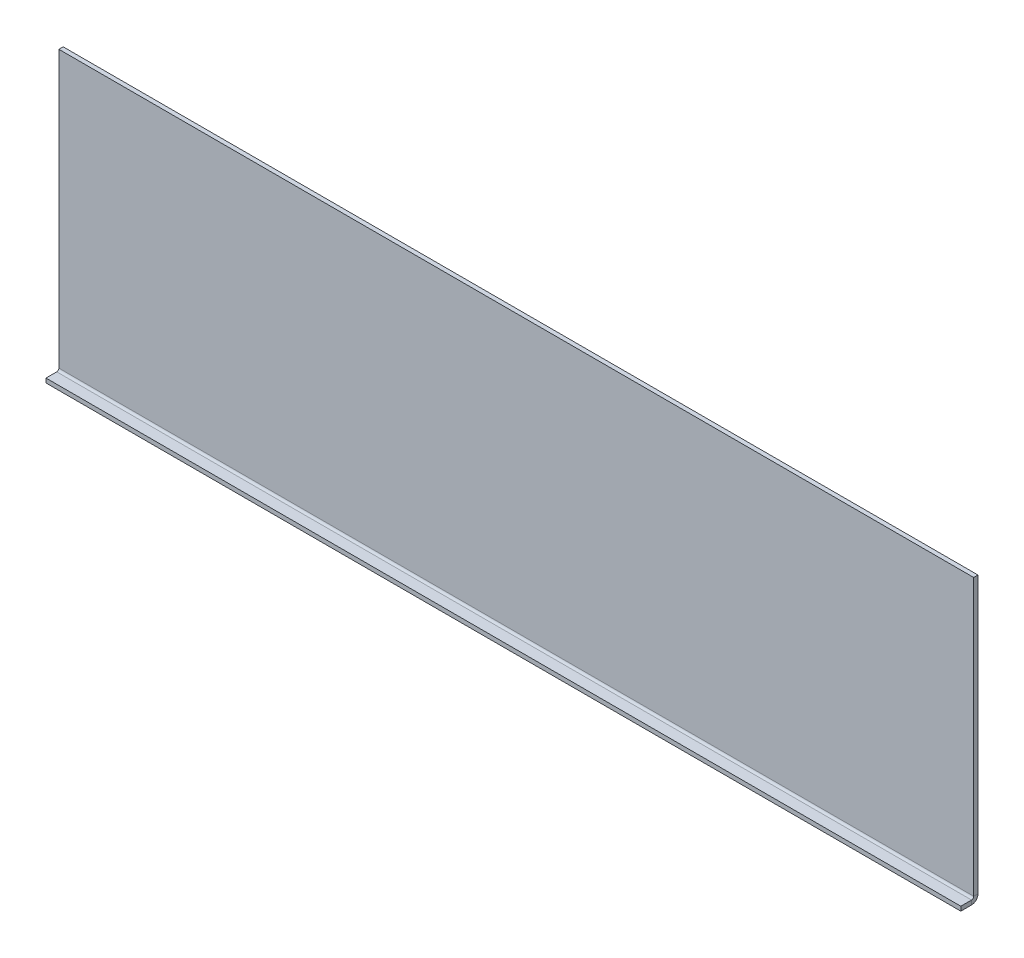
ISO-10303-21;
HEADER;
FILE_DESCRIPTION(('STEP AP214'),'2;1');
FILE_NAME('part.step','',(''),(''),'','','');
FILE_SCHEMA(('AUTOMOTIVE_DESIGN { 1 0 10303 214 1 1 1 1 }'));
ENDSEC;
DATA;
#1=APPLICATION_CONTEXT('core data for automotive mechanical design processes');
#2=APPLICATION_PROTOCOL_DEFINITION('international standard','automotive_design',2000,#1);
#3=PRODUCT_CONTEXT('',#1,'mechanical');
#4=PRODUCT('Part','Part','',(#3));
#5=PRODUCT_RELATED_PRODUCT_CATEGORY('part','',(#4));
#6=PRODUCT_DEFINITION_FORMATION('','',#4);
#7=PRODUCT_DEFINITION_CONTEXT('part definition',#1,'design');
#8=PRODUCT_DEFINITION('design','',#6,#7);
#9=PRODUCT_DEFINITION_SHAPE('','',#8);
#10=(LENGTH_UNIT() NAMED_UNIT(*) SI_UNIT(.MILLI.,.METRE.));
#11=(NAMED_UNIT(*) PLANE_ANGLE_UNIT() SI_UNIT($,.RADIAN.));
#12=(NAMED_UNIT(*) SI_UNIT($,.STERADIAN.) SOLID_ANGLE_UNIT());
#13=UNCERTAINTY_MEASURE_WITH_UNIT(LENGTH_MEASURE(1.E-05),#10,'distance_accuracy_value','');
#14=(GEOMETRIC_REPRESENTATION_CONTEXT(3) GLOBAL_UNCERTAINTY_ASSIGNED_CONTEXT((#13)) GLOBAL_UNIT_ASSIGNED_CONTEXT((#10,
#11,#12)) REPRESENTATION_CONTEXT('',''));
#15=CARTESIAN_POINT('',(0.,0.,0.));
#16=DIRECTION('',(0.,0.,1.));
#17=DIRECTION('',(1.,0.,0.));
#18=AXIS2_PLACEMENT_3D('',#15,#16,#17);
#19=CARTESIAN_POINT('',(0.,0.,-3.175));
#20=DIRECTION('',(-1.,0.,0.));
#21=DIRECTION('',(0.,0.,1.));
#22=AXIS2_PLACEMENT_3D('',#19,#20,#21);
#23=PLANE('',#22);
#24=DIRECTION('',(0.,-1.,0.));
#25=VECTOR('',#24,1.);
#26=CARTESIAN_POINT('',(0.,0.,0.));
#27=LINE('',#26,#25);
#28=CARTESIAN_POINT('',(0.,204.155039999943,0.));
#29=VERTEX_POINT('',#28);
#30=CARTESIAN_POINT('',(0.,0.,0.));
#31=VERTEX_POINT('',#30);
#32=EDGE_CURVE('E182',#29,#31,#27,.T.);
#33=ORIENTED_EDGE('',*,*,#32,.F.);
#34=DIRECTION('',(0.,0.,1.));
#35=VECTOR('',#34,1.);
#36=CARTESIAN_POINT('',(0.,204.155039999943,-3.175));
#37=LINE('',#36,#35);
#38=CARTESIAN_POINT('',(0.,204.155039999943,-3.175));
#39=VERTEX_POINT('',#38);
#40=EDGE_CURVE('E13',#39,#29,#37,.T.);
#41=ORIENTED_EDGE('',*,*,#40,.F.);
#42=DIRECTION('',(0.,-1.,0.));
#43=VECTOR('',#42,1.);
#44=CARTESIAN_POINT('',(0.,0.,-3.175));
#45=LINE('',#44,#43);
#46=CARTESIAN_POINT('',(0.,0.,-3.175));
#47=VERTEX_POINT('',#46);
#48=EDGE_CURVE('E187',#39,#47,#45,.T.);
#49=ORIENTED_EDGE('',*,*,#48,.T.);
#50=DIRECTION('',(0.,0.,1.));
#51=VECTOR('',#50,1.);
#52=CARTESIAN_POINT('',(0.,0.,-3.175));
#53=LINE('',#52,#51);
#54=EDGE_CURVE('E61',#47,#31,#53,.T.);
#55=ORIENTED_EDGE('',*,*,#54,.T.);
#56=EDGE_LOOP('',(#33,#41,#49,#55));
#57=FACE_BOUND('',#56,.T.);
#58=ADVANCED_FACE('F58',(#57),#23,.T.);
#59=CARTESIAN_POINT('',(0.,204.155039999943,-3.175));
#60=DIRECTION('',(0.,1.,0.));
#61=DIRECTION('',(0.,0.,1.));
#62=AXIS2_PLACEMENT_3D('',#59,#60,#61);
#63=PLANE('',#62);
#64=DIRECTION('',(-1.,0.,0.));
#65=VECTOR('',#64,1.);
#66=CARTESIAN_POINT('',(0.,204.155039999943,0.));
#67=LINE('',#66,#65);
#68=CARTESIAN_POINT('',(676.402,204.155039999943,0.));
#69=VERTEX_POINT('',#68);
#70=EDGE_CURVE('E189',#69,#29,#67,.T.);
#71=ORIENTED_EDGE('',*,*,#70,.F.);
#72=DIRECTION('',(0.,0.,1.));
#73=VECTOR('',#72,1.);
#74=CARTESIAN_POINT('',(676.402,204.155039999943,-3.175));
#75=LINE('',#74,#73);
#76=CARTESIAN_POINT('',(676.402,204.155039999943,-3.175));
#77=VERTEX_POINT('',#76);
#78=EDGE_CURVE('E67',#77,#69,#75,.T.);
#79=ORIENTED_EDGE('',*,*,#78,.F.);
#80=DIRECTION('',(-1.,0.,0.));
#81=VECTOR('',#80,1.);
#82=CARTESIAN_POINT('',(0.,204.155039999943,-3.175));
#83=LINE('',#82,#81);
#84=EDGE_CURVE('E193',#77,#39,#83,.T.);
#85=ORIENTED_EDGE('',*,*,#84,.T.);
#86=ORIENTED_EDGE('',*,*,#40,.T.);
#87=EDGE_LOOP('',(#71,#79,#85,#86));
#88=FACE_BOUND('',#87,.T.);
#89=ADVANCED_FACE('F234',(#88),#63,.T.);
#90=CARTESIAN_POINT('',(676.402,0.,-3.175));
#91=DIRECTION('',(1.,0.,0.));
#92=DIRECTION('',(0.,0.,-1.));
#93=AXIS2_PLACEMENT_3D('',#90,#91,#92);
#94=PLANE('',#93);
#95=DIRECTION('',(0.,1.,0.));
#96=VECTOR('',#95,1.);
#97=CARTESIAN_POINT('',(676.402,0.,0.));
#98=LINE('',#97,#96);
#99=CARTESIAN_POINT('',(676.402,0.,0.));
#100=VERTEX_POINT('',#99);
#101=EDGE_CURVE('E200',#100,#69,#98,.T.);
#102=ORIENTED_EDGE('',*,*,#101,.F.);
#103=DIRECTION('',(0.,0.,1.));
#104=VECTOR('',#103,1.);
#105=CARTESIAN_POINT('',(676.402,0.,-3.175));
#106=LINE('',#105,#104);
#107=CARTESIAN_POINT('',(676.402,0.,-3.17499999999998));
#108=VERTEX_POINT('',#107);
#109=EDGE_CURVE('E204',#108,#100,#106,.T.);
#110=ORIENTED_EDGE('',*,*,#109,.F.);
#111=DIRECTION('',(0.,1.,0.));
#112=VECTOR('',#111,1.);
#113=CARTESIAN_POINT('',(676.402,0.,-3.175));
#114=LINE('',#113,#112);
#115=EDGE_CURVE('E191',#108,#77,#114,.T.);
#116=ORIENTED_EDGE('',*,*,#115,.T.);
#117=ORIENTED_EDGE('',*,*,#78,.T.);
#118=EDGE_LOOP('',(#102,#110,#116,#117));
#119=FACE_BOUND('',#118,.T.);
#120=ADVANCED_FACE('F238',(#119),#94,.T.);
#121=CARTESIAN_POINT('',(0.,0.,-3.175));
#122=DIRECTION('',(0.,0.,-1.));
#123=DIRECTION('',(-1.,0.,0.));
#124=AXIS2_PLACEMENT_3D('',#121,#122,#123);
#125=PLANE('',#124);
#126=ORIENTED_EDGE('',*,*,#48,.F.);
#127=ORIENTED_EDGE('',*,*,#84,.F.);
#128=ORIENTED_EDGE('',*,*,#115,.F.);
#129=DIRECTION('',(1.,0.,0.));
#130=VECTOR('',#129,1.);
#131=CARTESIAN_POINT('',(0.,0.,-3.175));
#132=LINE('',#131,#130);
#133=EDGE_CURVE('E99',#47,#108,#132,.T.);
#134=ORIENTED_EDGE('',*,*,#133,.F.);
#135=EDGE_LOOP('',(#126,#127,#128,#134));
#136=FACE_BOUND('',#135,.T.);
#137=ADVANCED_FACE('F243',(#136),#125,.T.);
#138=CARTESIAN_POINT('',(0.,0.,0.));
#139=DIRECTION('',(0.,0.,-1.));
#140=DIRECTION('',(-1.,0.,0.));
#141=AXIS2_PLACEMENT_3D('',#138,#139,#140);
#142=PLANE('',#141);
#143=ORIENTED_EDGE('',*,*,#32,.T.);
#144=DIRECTION('',(1.,0.,0.));
#145=VECTOR('',#144,1.);
#146=CARTESIAN_POINT('',(0.,0.,0.));
#147=LINE('',#146,#145);
#148=EDGE_CURVE('E197',#31,#100,#147,.T.);
#149=ORIENTED_EDGE('',*,*,#148,.T.);
#150=ORIENTED_EDGE('',*,*,#101,.T.);
#151=ORIENTED_EDGE('',*,*,#70,.T.);
#152=EDGE_LOOP('',(#143,#149,#150,#151));
#153=FACE_BOUND('',#152,.T.);
#154=ADVANCED_FACE('F211',(#153),#142,.F.);
#155=CARTESIAN_POINT('',(0.,0.,1.5875));
#156=DIRECTION('',(-1.,0.,0.));
#157=DIRECTION('',(0.,-1.,0.));
#158=AXIS2_PLACEMENT_3D('',#155,#156,#157);
#159=PLANE('',#158);
#160=DIRECTION('',(0.,-1.,0.));
#161=VECTOR('',#160,1.);
#162=CARTESIAN_POINT('',(0.,-4.7625,1.58749999999998));
#163=LINE('',#162,#161);
#164=CARTESIAN_POINT('',(0.,-1.5875,1.58749999999999));
#165=VERTEX_POINT('',#164);
#166=CARTESIAN_POINT('',(0.,-4.7625,1.58749999999998));
#167=VERTEX_POINT('',#166);
#168=EDGE_CURVE('E179',#165,#167,#163,.T.);
#169=ORIENTED_EDGE('',*,*,#168,.F.);
#170=CARTESIAN_POINT('',(0.,0.,1.5875));
#171=DIRECTION('',(1.,0.,0.));
#172=DIRECTION('',(0.,1.,0.));
#173=AXIS2_PLACEMENT_3D('',#170,#171,#172);
#174=CIRCLE('',#173,1.58749999999998);
#175=EDGE_CURVE('E137',#31,#165,#174,.F.);
#176=ORIENTED_EDGE('',*,*,#175,.F.);
#177=ORIENTED_EDGE('',*,*,#54,.F.);
#178=CARTESIAN_POINT('',(0.,0.,1.5875));
#179=DIRECTION('',(1.,0.,0.));
#180=DIRECTION('',(0.,1.,0.));
#181=AXIS2_PLACEMENT_3D('',#178,#179,#180);
#182=CIRCLE('',#181,4.76249999999998);
#183=EDGE_CURVE('E136',#47,#167,#182,.F.);
#184=ORIENTED_EDGE('',*,*,#183,.T.);
#185=EDGE_LOOP('',(#169,#176,#177,#184));
#186=FACE_BOUND('',#185,.T.);
#187=ADVANCED_FACE('F215',(#186),#159,.T.);
#188=CARTESIAN_POINT('',(676.402,0.,1.5875));
#189=DIRECTION('',(-1.,0.,0.));
#190=DIRECTION('',(0.,-1.,0.));
#191=AXIS2_PLACEMENT_3D('',#188,#189,#190);
#192=PLANE('',#191);
#193=CARTESIAN_POINT('',(676.402,0.,1.5875));
#194=DIRECTION('',(1.,0.,0.));
#195=DIRECTION('',(0.,1.,0.));
#196=AXIS2_PLACEMENT_3D('',#193,#194,#195);
#197=CIRCLE('',#196,1.58749999999998);
#198=CARTESIAN_POINT('',(676.402,-1.58749999999995,1.58749999999999));
#199=VERTEX_POINT('',#198);
#200=EDGE_CURVE('E144',#199,#100,#197,.T.);
#201=ORIENTED_EDGE('',*,*,#200,.F.);
#202=DIRECTION('',(0.,-1.,0.));
#203=VECTOR('',#202,1.);
#204=CARTESIAN_POINT('',(676.402,-1.5875,1.58749999999999));
#205=LINE('',#204,#203);
#206=CARTESIAN_POINT('',(676.402,-4.7625,1.58749999999998));
#207=VERTEX_POINT('',#206);
#208=EDGE_CURVE('E141',#199,#207,#205,.T.);
#209=ORIENTED_EDGE('',*,*,#208,.T.);
#210=CARTESIAN_POINT('',(676.402,0.,1.5875));
#211=DIRECTION('',(1.,0.,0.));
#212=DIRECTION('',(0.,1.,0.));
#213=AXIS2_PLACEMENT_3D('',#210,#211,#212);
#214=CIRCLE('',#213,4.76249999999998);
#215=EDGE_CURVE('E127',#207,#108,#214,.T.);
#216=ORIENTED_EDGE('',*,*,#215,.T.);
#217=ORIENTED_EDGE('',*,*,#109,.T.);
#218=EDGE_LOOP('',(#201,#209,#216,#217));
#219=FACE_BOUND('',#218,.T.);
#220=ADVANCED_FACE('F142',(#219),#192,.F.);
#221=CARTESIAN_POINT('',(676.402,0.,1.5875));
#222=DIRECTION('',(1.,0.,0.));
#223=DIRECTION('',(0.,-1.,0.));
#224=AXIS2_PLACEMENT_3D('',#221,#222,#223);
#225=CYLINDRICAL_SURFACE('',#224,4.76249999999998);
#226=ORIENTED_EDGE('',*,*,#133,.T.);
#227=ORIENTED_EDGE('',*,*,#215,.F.);
#228=DIRECTION('',(1.,0.,0.));
#229=VECTOR('',#228,1.);
#230=CARTESIAN_POINT('',(0.,-4.7625,1.58749999999998));
#231=LINE('',#230,#229);
#232=EDGE_CURVE('E132',#167,#207,#231,.T.);
#233=ORIENTED_EDGE('',*,*,#232,.F.);
#234=ORIENTED_EDGE('',*,*,#183,.F.);
#235=EDGE_LOOP('',(#226,#227,#233,#234));
#236=FACE_BOUND('',#235,.T.);
#237=ADVANCED_FACE('F129',(#236),#225,.T.);
#238=CARTESIAN_POINT('',(676.402,0.,1.5875));
#239=DIRECTION('',(1.,0.,0.));
#240=DIRECTION('',(0.,-1.,0.));
#241=AXIS2_PLACEMENT_3D('',#238,#239,#240);
#242=CYLINDRICAL_SURFACE('',#241,1.58749999999998);
#243=ORIENTED_EDGE('',*,*,#148,.F.);
#244=ORIENTED_EDGE('',*,*,#175,.T.);
#245=DIRECTION('',(-1.,0.,0.));
#246=VECTOR('',#245,1.);
#247=CARTESIAN_POINT('',(-1.11022302462516E-13,-1.5875,1.58749999999999));
#248=LINE('',#247,#246);
#249=EDGE_CURVE('E149',#165,#199,#248,.F.);
#250=ORIENTED_EDGE('',*,*,#249,.T.);
#251=ORIENTED_EDGE('',*,*,#200,.T.);
#252=EDGE_LOOP('',(#243,#244,#250,#251));
#253=FACE_BOUND('',#252,.T.);
#254=ADVANCED_FACE('F213',(#253),#242,.F.);
#255=CARTESIAN_POINT('',(676.402,-4.76249999999999,0.));
#256=DIRECTION('',(1.,0.,0.));
#257=DIRECTION('',(0.,0.,-1.));
#258=AXIS2_PLACEMENT_3D('',#255,#256,#257);
#259=PLANE('',#258);
#260=DIRECTION('',(0.,0.,-1.));
#261=VECTOR('',#260,1.);
#262=CARTESIAN_POINT('',(676.402,-4.76249999999999,0.));
#263=LINE('',#262,#261);
#264=CARTESIAN_POINT('',(676.402,-4.76250000000003,9.525));
#265=VERTEX_POINT('',#264);
#266=EDGE_CURVE('E156',#265,#207,#263,.T.);
#267=ORIENTED_EDGE('',*,*,#266,.T.);
#268=ORIENTED_EDGE('',*,*,#208,.F.);
#269=DIRECTION('',(0.,0.,1.));
#270=VECTOR('',#269,1.);
#271=CARTESIAN_POINT('',(676.402,-1.58749999999999,0.));
#272=LINE('',#271,#270);
#273=CARTESIAN_POINT('',(676.402,-1.58750000000003,9.52500000000001));
#274=VERTEX_POINT('',#273);
#275=EDGE_CURVE('E172',#274,#199,#272,.F.);
#276=ORIENTED_EDGE('',*,*,#275,.F.);
#277=DIRECTION('',(0.,1.,0.));
#278=VECTOR('',#277,1.);
#279=CARTESIAN_POINT('',(676.402,-4.76250000000003,9.525));
#280=LINE('',#279,#278);
#281=EDGE_CURVE('E161',#265,#274,#280,.T.);
#282=ORIENTED_EDGE('',*,*,#281,.F.);
#283=EDGE_LOOP('',(#267,#268,#276,#282));
#284=FACE_BOUND('',#283,.T.);
#285=ADVANCED_FACE('F160',(#284),#259,.T.);
#286=CARTESIAN_POINT('',(-2.22044604925031E-13,-4.76250000000003,9.525));
#287=DIRECTION('',(-1.,0.,0.));
#288=DIRECTION('',(0.,0.,1.));
#289=AXIS2_PLACEMENT_3D('',#286,#287,#288);
#290=PLANE('',#289);
#291=DIRECTION('',(0.,0.,-1.));
#292=VECTOR('',#291,1.);
#293=CARTESIAN_POINT('',(0.,-1.58749999999999,0.));
#294=LINE('',#293,#292);
#295=CARTESIAN_POINT('',(-2.22044604925031E-13,-1.58750000000003,9.52500000000001));
#296=VERTEX_POINT('',#295);
#297=EDGE_CURVE('E158',#165,#296,#294,.F.);
#298=ORIENTED_EDGE('',*,*,#297,.F.);
#299=ORIENTED_EDGE('',*,*,#168,.T.);
#300=DIRECTION('',(0.,0.,1.));
#301=VECTOR('',#300,1.);
#302=CARTESIAN_POINT('',(-2.22044604925031E-13,-4.76250000000003,9.525));
#303=LINE('',#302,#301);
#304=CARTESIAN_POINT('',(-2.22044604925031E-13,-4.76250000000003,9.525));
#305=VERTEX_POINT('',#304);
#306=EDGE_CURVE('E157',#167,#305,#303,.T.);
#307=ORIENTED_EDGE('',*,*,#306,.T.);
#308=DIRECTION('',(0.,1.,0.));
#309=VECTOR('',#308,1.);
#310=CARTESIAN_POINT('',(-2.22044604925031E-13,-4.76250000000003,9.525));
#311=LINE('',#310,#309);
#312=EDGE_CURVE('E163',#305,#296,#311,.T.);
#313=ORIENTED_EDGE('',*,*,#312,.T.);
#314=EDGE_LOOP('',(#298,#299,#307,#313));
#315=FACE_BOUND('',#314,.T.);
#316=ADVANCED_FACE('F218',(#315),#290,.T.);
#317=CARTESIAN_POINT('',(0.,-4.76249999999999,0.));
#318=DIRECTION('',(0.,-1.,0.));
#319=DIRECTION('',(0.,0.,-1.));
#320=AXIS2_PLACEMENT_3D('',#317,#318,#319);
#321=PLANE('',#320);
#322=ORIENTED_EDGE('',*,*,#306,.F.);
#323=ORIENTED_EDGE('',*,*,#232,.T.);
#324=ORIENTED_EDGE('',*,*,#266,.F.);
#325=DIRECTION('',(1.,0.,0.));
#326=VECTOR('',#325,1.);
#327=CARTESIAN_POINT('',(676.402,-4.76250000000003,9.525));
#328=LINE('',#327,#326);
#329=EDGE_CURVE('E164',#305,#265,#328,.T.);
#330=ORIENTED_EDGE('',*,*,#329,.F.);
#331=EDGE_LOOP('',(#322,#323,#324,#330));
#332=FACE_BOUND('',#331,.T.);
#333=ADVANCED_FACE('F154',(#332),#321,.T.);
#334=CARTESIAN_POINT('',(0.,-1.58749999999999,0.));
#335=DIRECTION('',(0.,-1.,0.));
#336=DIRECTION('',(0.,0.,-1.));
#337=AXIS2_PLACEMENT_3D('',#334,#335,#336);
#338=PLANE('',#337);
#339=ORIENTED_EDGE('',*,*,#249,.F.);
#340=ORIENTED_EDGE('',*,*,#297,.T.);
#341=DIRECTION('',(-1.,0.,0.));
#342=VECTOR('',#341,1.);
#343=CARTESIAN_POINT('',(0.,-1.58750000000003,9.52500000000001));
#344=LINE('',#343,#342);
#345=EDGE_CURVE('E174',#296,#274,#344,.F.);
#346=ORIENTED_EDGE('',*,*,#345,.T.);
#347=ORIENTED_EDGE('',*,*,#275,.T.);
#348=EDGE_LOOP('',(#339,#340,#346,#347));
#349=FACE_BOUND('',#348,.T.);
#350=ADVANCED_FACE('F222',(#349),#338,.F.);
#351=CARTESIAN_POINT('',(676.402,-4.76250000000003,9.525));
#352=DIRECTION('',(0.,0.,1.));
#353=DIRECTION('',(0.,-1.,0.));
#354=AXIS2_PLACEMENT_3D('',#351,#352,#353);
#355=PLANE('',#354);
#356=ORIENTED_EDGE('',*,*,#345,.F.);
#357=ORIENTED_EDGE('',*,*,#312,.F.);
#358=ORIENTED_EDGE('',*,*,#329,.T.);
#359=ORIENTED_EDGE('',*,*,#281,.T.);
#360=EDGE_LOOP('',(#356,#357,#358,#359));
#361=FACE_BOUND('',#360,.T.);
#362=ADVANCED_FACE('F224',(#361),#355,.T.);
#363=CLOSED_SHELL('',(#58,#89,#120,#137,#154,#187,#220,#237,#254,#285,#316,#333,#350,#362));
#364=MANIFOLD_SOLID_BREP('B2',#363);
#365=ADVANCED_BREP_SHAPE_REPRESENTATION('',(#18,#364),#14);
#366=SHAPE_DEFINITION_REPRESENTATION(#9,#365);
ENDSEC;
END-ISO-10303-21;
